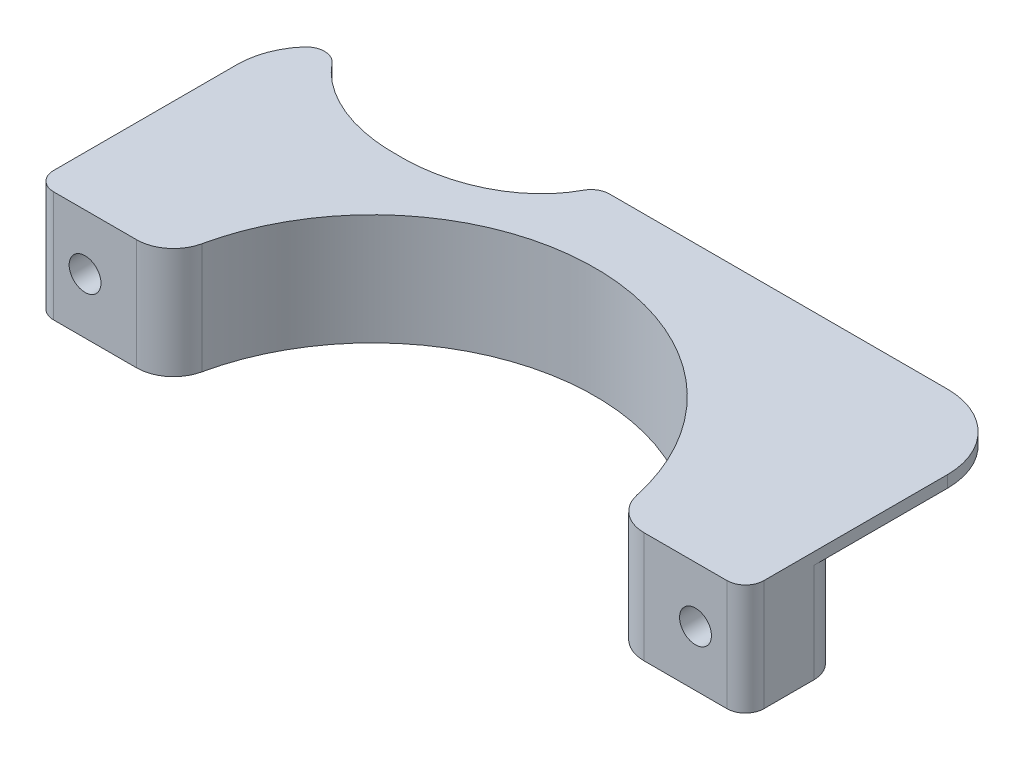
ISO-10303-21;
HEADER;
FILE_DESCRIPTION(('STEP AP214'),'2;1');
FILE_NAME('part.step','',(''),(''),'','','');
FILE_SCHEMA(('AUTOMOTIVE_DESIGN { 1 0 10303 214 1 1 1 1 }'));
ENDSEC;
DATA;
#1=APPLICATION_CONTEXT('core data for automotive mechanical design processes');
#2=APPLICATION_PROTOCOL_DEFINITION('international standard','automotive_design',2000,#1);
#3=PRODUCT_CONTEXT('',#1,'mechanical');
#4=PRODUCT('Part','Part','',(#3));
#5=PRODUCT_RELATED_PRODUCT_CATEGORY('part','',(#4));
#6=PRODUCT_DEFINITION_FORMATION('','',#4);
#7=PRODUCT_DEFINITION_CONTEXT('part definition',#1,'design');
#8=PRODUCT_DEFINITION('design','',#6,#7);
#9=PRODUCT_DEFINITION_SHAPE('','',#8);
#10=(LENGTH_UNIT() NAMED_UNIT(*) SI_UNIT(.MILLI.,.METRE.));
#11=(NAMED_UNIT(*) PLANE_ANGLE_UNIT() SI_UNIT($,.RADIAN.));
#12=(NAMED_UNIT(*) SI_UNIT($,.STERADIAN.) SOLID_ANGLE_UNIT());
#13=UNCERTAINTY_MEASURE_WITH_UNIT(LENGTH_MEASURE(1.E-05),#10,'distance_accuracy_value','');
#14=(GEOMETRIC_REPRESENTATION_CONTEXT(3) GLOBAL_UNCERTAINTY_ASSIGNED_CONTEXT((#13)) GLOBAL_UNIT_ASSIGNED_CONTEXT((#10,
#11,#12)) REPRESENTATION_CONTEXT('',''));
#15=CARTESIAN_POINT('',(0.,0.,0.));
#16=DIRECTION('',(0.,0.,1.));
#17=DIRECTION('',(1.,0.,0.));
#18=AXIS2_PLACEMENT_3D('',#15,#16,#17);
#19=CARTESIAN_POINT('',(1612.138,154.051600930678,124.642988708345));
#20=DIRECTION('',(0.,0.,1.));
#21=DIRECTION('',(-1.,0.,0.));
#22=AXIS2_PLACEMENT_3D('',#19,#20,#21);
#23=PLANE('',#22);
#24=DIRECTION('',(-1.,0.,0.));
#25=VECTOR('',#24,1.);
#26=CARTESIAN_POINT('',(1612.138,163.576600930678,124.642988708345));
#27=LINE('',#26,#25);
#28=CARTESIAN_POINT('',(1605.788,163.576600930678,124.642988708345));
#29=VERTEX_POINT('',#28);
#30=CARTESIAN_POINT('',(1576.78248811507,163.576600930678,124.642988708345));
#31=VERTEX_POINT('',#30);
#32=EDGE_CURVE('E289',#29,#31,#27,.T.);
#33=ORIENTED_EDGE('',*,*,#32,.F.);
#34=DIRECTION('',(0.,1.,0.));
#35=VECTOR('',#34,1.);
#36=CARTESIAN_POINT('',(1605.788,163.576600930678,124.642988708345));
#37=LINE('',#36,#35);
#38=CARTESIAN_POINT('',(1605.788,162.560600930678,124.642988708345));
#39=VERTEX_POINT('',#38);
#40=EDGE_CURVE('E344',#39,#29,#37,.T.);
#41=ORIENTED_EDGE('',*,*,#40,.F.);
#42=DIRECTION('',(-1.,0.,0.));
#43=VECTOR('',#42,1.);
#44=CARTESIAN_POINT('',(1581.658,162.560600930678,124.642988708345));
#45=LINE('',#44,#43);
#46=CARTESIAN_POINT('',(1576.78248811507,162.560600930678,124.642988708345));
#47=VERTEX_POINT('',#46);
#48=EDGE_CURVE('E245',#39,#47,#45,.T.);
#49=ORIENTED_EDGE('',*,*,#48,.T.);
#50=DIRECTION('',(0.,-1.,0.));
#51=VECTOR('',#50,1.);
#52=CARTESIAN_POINT('',(1576.78248811507,154.051600930678,124.642988708345));
#53=LINE('',#52,#51);
#54=EDGE_CURVE('E212',#31,#47,#53,.T.);
#55=ORIENTED_EDGE('',*,*,#54,.F.);
#56=EDGE_LOOP('',(#33,#41,#49,#55));
#57=FACE_BOUND('',#56,.T.);
#58=ADVANCED_FACE('F37',(#57),#23,.F.);
#59=CARTESIAN_POINT('',(1557.528,154.051600930678,130.992988708345));
#60=DIRECTION('',(0.,-1.,0.));
#61=DIRECTION('',(0.,0.,1.));
#62=AXIS2_PLACEMENT_3D('',#59,#60,#61);
#63=CYLINDRICAL_SURFACE('',#62,6.35);
#64=CARTESIAN_POINT('',(1557.528,162.560600930678,130.992988708345));
#65=DIRECTION('',(0.,-1.,0.));
#66=DIRECTION('',(0.,0.,-1.));
#67=AXIS2_PLACEMENT_3D('',#64,#65,#66);
#68=CIRCLE('',#67,6.35);
#69=CARTESIAN_POINT('',(1552.74874703953,162.560600930678,126.81193128948));
#70=VERTEX_POINT('',#69);
#71=CARTESIAN_POINT('',(1551.178,162.560600930678,130.992988708345));
#72=VERTEX_POINT('',#71);
#73=EDGE_CURVE('E355',#70,#72,#68,.F.);
#74=ORIENTED_EDGE('',*,*,#73,.T.);
#75=DIRECTION('',(0.,1.,0.));
#76=VECTOR('',#75,1.);
#77=CARTESIAN_POINT('',(1551.178,163.576600930678,130.992988708345));
#78=LINE('',#77,#76);
#79=CARTESIAN_POINT('',(1551.178,163.576600930678,130.992988708345));
#80=VERTEX_POINT('',#79);
#81=EDGE_CURVE('E360',#72,#80,#78,.T.);
#82=ORIENTED_EDGE('',*,*,#81,.T.);
#83=CARTESIAN_POINT('',(1557.528,163.576600930678,130.992988708345));
#84=DIRECTION('',(0.,-1.,0.));
#85=DIRECTION('',(0.,0.,-1.));
#86=AXIS2_PLACEMENT_3D('',#83,#84,#85);
#87=CIRCLE('',#86,6.35);
#88=CARTESIAN_POINT('',(1552.74874703953,163.576600930678,126.81193128948));
#89=VERTEX_POINT('',#88);
#90=EDGE_CURVE('E347',#80,#89,#87,.T.);
#91=ORIENTED_EDGE('',*,*,#90,.T.);
#92=DIRECTION('',(0.,-1.,0.));
#93=VECTOR('',#92,1.);
#94=CARTESIAN_POINT('',(1552.74874703953,154.051600930678,126.81193128948));
#95=LINE('',#94,#93);
#96=EDGE_CURVE('E12',#70,#89,#95,.F.);
#97=ORIENTED_EDGE('',*,*,#96,.F.);
#98=EDGE_LOOP('',(#74,#82,#91,#97));
#99=FACE_BOUND('',#98,.T.);
#100=ADVANCED_FACE('F505',(#99),#63,.T.);
#101=CARTESIAN_POINT('',(1551.178,154.051600930678,148.336));
#102=DIRECTION('',(0.,0.,1.));
#103=DIRECTION('',(-1.,0.,0.));
#104=AXIS2_PLACEMENT_3D('',#101,#102,#103);
#105=PLANE('',#104);
#106=CARTESIAN_POINT('',(1555.46425,158.814100930678,148.336));
#107=DIRECTION('',(0.,0.,-1.));
#108=DIRECTION('',(1.,0.,0.));
#109=AXIS2_PLACEMENT_3D('',#106,#107,#108);
#110=CIRCLE('',#109,1.36525000000017);
#111=CARTESIAN_POINT('',(1556.8295,158.814100930678,148.336));
#112=VERTEX_POINT('',#111);
#113=EDGE_CURVE('E223',#112,#112,#110,.T.);
#114=ORIENTED_EDGE('',*,*,#113,.T.);
#115=EDGE_LOOP('',(#114));
#116=FACE_BOUND('',#115,.T.);
#117=DIRECTION('',(-1.,0.,0.));
#118=VECTOR('',#117,1.);
#119=CARTESIAN_POINT('',(1551.178,163.576600930678,148.336));
#120=LINE('',#119,#118);
#121=CARTESIAN_POINT('',(1559.88345833686,163.576600930678,148.336));
#122=VERTEX_POINT('',#121);
#123=CARTESIAN_POINT('',(1552.7655,163.576600930678,148.336));
#124=VERTEX_POINT('',#123);
#125=EDGE_CURVE('E264',#122,#124,#120,.T.);
#126=ORIENTED_EDGE('',*,*,#125,.T.);
#127=DIRECTION('',(0.,1.,0.));
#128=VECTOR('',#127,1.);
#129=CARTESIAN_POINT('',(1552.7655,154.051600930678,148.336));
#130=LINE('',#129,#128);
#131=CARTESIAN_POINT('',(1552.7655,154.051600930678,148.336));
#132=VERTEX_POINT('',#131);
#133=EDGE_CURVE('E304',#132,#124,#130,.T.);
#134=ORIENTED_EDGE('',*,*,#133,.F.);
#135=DIRECTION('',(-1.,0.,0.));
#136=VECTOR('',#135,1.);
#137=CARTESIAN_POINT('',(1551.178,154.051600930678,148.336));
#138=LINE('',#137,#136);
#139=CARTESIAN_POINT('',(1559.88345833686,154.051600930678,148.336));
#140=VERTEX_POINT('',#139);
#141=EDGE_CURVE('E273',#140,#132,#138,.T.);
#142=ORIENTED_EDGE('',*,*,#141,.F.);
#143=DIRECTION('',(0.,1.,0.));
#144=VECTOR('',#143,1.);
#145=CARTESIAN_POINT('',(1559.88345833686,154.051600930678,148.336));
#146=LINE('',#145,#144);
#147=EDGE_CURVE('E334',#122,#140,#146,.F.);
#148=ORIENTED_EDGE('',*,*,#147,.F.);
#149=EDGE_LOOP('',(#126,#134,#142,#148));
#150=FACE_BOUND('',#149,.T.);
#151=ADVANCED_FACE('F513',(#116,#150),#105,.T.);
#152=CARTESIAN_POINT('',(1581.658,154.051600930678,149.86));
#153=DIRECTION('',(0.,1.,0.));
#154=DIRECTION('',(0.,0.,-1.));
#155=AXIS2_PLACEMENT_3D('',#152,#153,#154);
#156=CYLINDRICAL_SURFACE('',#155,19.1008000000002);
#157=CARTESIAN_POINT('',(1581.658,154.051600930678,149.86));
#158=DIRECTION('',(0.,1.,0.));
#159=DIRECTION('',(0.,0.,-1.));
#160=AXIS2_PLACEMENT_3D('',#157,#158,#159);
#161=CIRCLE('',#160,19.1008000000002);
#162=CARTESIAN_POINT('',(1600.32898669405,154.051600930678,145.830754846066));
#163=VERTEX_POINT('',#162);
#164=CARTESIAN_POINT('',(1562.98701330595,154.051600930678,145.830754846066));
#165=VERTEX_POINT('',#164);
#166=EDGE_CURVE('E286',#163,#165,#161,.T.);
#167=ORIENTED_EDGE('',*,*,#166,.F.);
#168=DIRECTION('',(0.,1.,0.));
#169=VECTOR('',#168,1.);
#170=CARTESIAN_POINT('',(1600.32898669405,154.051600930678,145.830754846066));
#171=LINE('',#170,#169);
#172=CARTESIAN_POINT('',(1600.32898669405,163.576600930678,145.830754846066));
#173=VERTEX_POINT('',#172);
#174=EDGE_CURVE('E324',#173,#163,#171,.F.);
#175=ORIENTED_EDGE('',*,*,#174,.F.);
#176=CARTESIAN_POINT('',(1581.658,163.576600930678,149.86));
#177=DIRECTION('',(0.,1.,0.));
#178=DIRECTION('',(0.,0.,-1.));
#179=AXIS2_PLACEMENT_3D('',#176,#177,#178);
#180=CIRCLE('',#179,19.1008000000002);
#181=CARTESIAN_POINT('',(1562.98701330595,163.576600930678,145.830754846066));
#182=VERTEX_POINT('',#181);
#183=EDGE_CURVE('E277',#173,#182,#180,.T.);
#184=ORIENTED_EDGE('',*,*,#183,.T.);
#185=DIRECTION('',(0.,1.,0.));
#186=VECTOR('',#185,1.);
#187=CARTESIAN_POINT('',(1562.98701330595,154.051600930678,145.830754846066));
#188=LINE('',#187,#186);
#189=EDGE_CURVE('E327',#165,#182,#188,.T.);
#190=ORIENTED_EDGE('',*,*,#189,.F.);
#191=EDGE_LOOP('',(#167,#175,#184,#190));
#192=FACE_BOUND('',#191,.T.);
#193=ADVANCED_FACE('F522',(#192),#156,.F.);
#194=CARTESIAN_POINT('',(1600.69790505859,154.051600930678,148.336));
#195=DIRECTION('',(0.,0.,1.));
#196=DIRECTION('',(-1.,0.,0.));
#197=AXIS2_PLACEMENT_3D('',#194,#195,#196);
#198=PLANE('',#197);
#199=CARTESIAN_POINT('',(1607.85175,158.814100930678,148.336));
#200=DIRECTION('',(0.,0.,-1.));
#201=DIRECTION('',(-1.,0.,0.));
#202=AXIS2_PLACEMENT_3D('',#199,#200,#201);
#203=CIRCLE('',#202,1.36525000000017);
#204=CARTESIAN_POINT('',(1606.4865,158.814100930678,148.336));
#205=VERTEX_POINT('',#204);
#206=EDGE_CURVE('E241',#205,#205,#203,.T.);
#207=ORIENTED_EDGE('',*,*,#206,.T.);
#208=EDGE_LOOP('',(#207));
#209=FACE_BOUND('',#208,.T.);
#210=DIRECTION('',(-1.,0.,0.));
#211=VECTOR('',#210,1.);
#212=CARTESIAN_POINT('',(1600.69790505859,154.051600930678,148.336));
#213=LINE('',#212,#211);
#214=CARTESIAN_POINT('',(1610.5505,154.051600930678,148.336));
#215=VERTEX_POINT('',#214);
#216=CARTESIAN_POINT('',(1603.43254166314,154.051600930678,148.336));
#217=VERTEX_POINT('',#216);
#218=EDGE_CURVE('E283',#215,#217,#213,.T.);
#219=ORIENTED_EDGE('',*,*,#218,.F.);
#220=DIRECTION('',(0.,1.,0.));
#221=VECTOR('',#220,1.);
#222=CARTESIAN_POINT('',(1610.5505,154.051600930678,148.336));
#223=LINE('',#222,#221);
#224=CARTESIAN_POINT('',(1610.5505,163.576600930678,148.336));
#225=VERTEX_POINT('',#224);
#226=EDGE_CURVE('E321',#225,#215,#223,.F.);
#227=ORIENTED_EDGE('',*,*,#226,.F.);
#228=DIRECTION('',(-1.,0.,0.));
#229=VECTOR('',#228,1.);
#230=CARTESIAN_POINT('',(1600.69790505859,163.576600930678,148.336));
#231=LINE('',#230,#229);
#232=CARTESIAN_POINT('',(1603.43254166314,163.576600930678,148.336));
#233=VERTEX_POINT('',#232);
#234=EDGE_CURVE('E297',#225,#233,#231,.T.);
#235=ORIENTED_EDGE('',*,*,#234,.T.);
#236=DIRECTION('',(0.,1.,0.));
#237=VECTOR('',#236,1.);
#238=CARTESIAN_POINT('',(1603.43254166314,154.051600930678,148.336));
#239=LINE('',#238,#237);
#240=EDGE_CURVE('E341',#217,#233,#239,.T.);
#241=ORIENTED_EDGE('',*,*,#240,.F.);
#242=EDGE_LOOP('',(#219,#227,#235,#241));
#243=FACE_BOUND('',#242,.T.);
#244=ADVANCED_FACE('F529',(#209,#243),#198,.T.);
#245=CARTESIAN_POINT('',(1612.138,154.051600930678,148.336));
#246=DIRECTION('',(1.,0.,0.));
#247=DIRECTION('',(0.,0.,1.));
#248=AXIS2_PLACEMENT_3D('',#245,#246,#247);
#249=PLANE('',#248);
#250=DIRECTION('',(0.,0.,-1.));
#251=VECTOR('',#250,1.);
#252=CARTESIAN_POINT('',(1612.138,162.560600930678,140.081));
#253=LINE('',#252,#251);
#254=CARTESIAN_POINT('',(1612.138,162.560600930678,142.46225));
#255=VERTEX_POINT('',#254);
#256=CARTESIAN_POINT('',(1612.138,162.560600930678,130.992988708345));
#257=VERTEX_POINT('',#256);
#258=EDGE_CURVE('E265',#255,#257,#253,.T.);
#259=ORIENTED_EDGE('',*,*,#258,.T.);
#260=DIRECTION('',(0.,1.,0.));
#261=VECTOR('',#260,1.);
#262=CARTESIAN_POINT('',(1612.138,162.560600930678,130.992988708345));
#263=LINE('',#262,#261);
#264=CARTESIAN_POINT('',(1612.138,163.576600930678,130.992988708345));
#265=VERTEX_POINT('',#264);
#266=EDGE_CURVE('E352',#265,#257,#263,.F.);
#267=ORIENTED_EDGE('',*,*,#266,.F.);
#268=DIRECTION('',(0.,0.,1.));
#269=VECTOR('',#268,1.);
#270=CARTESIAN_POINT('',(1612.138,163.576600930678,148.336));
#271=LINE('',#270,#269);
#272=CARTESIAN_POINT('',(1612.138,163.576600930678,146.7485));
#273=VERTEX_POINT('',#272);
#274=EDGE_CURVE('E294',#265,#273,#271,.T.);
#275=ORIENTED_EDGE('',*,*,#274,.T.);
#276=DIRECTION('',(0.,1.,0.));
#277=VECTOR('',#276,1.);
#278=CARTESIAN_POINT('',(1612.138,154.051600930678,146.7485));
#279=LINE('',#278,#277);
#280=CARTESIAN_POINT('',(1612.138,154.051600930678,146.7485));
#281=VERTEX_POINT('',#280);
#282=EDGE_CURVE('E318',#281,#273,#279,.T.);
#283=ORIENTED_EDGE('',*,*,#282,.F.);
#284=DIRECTION('',(0.,0.,1.));
#285=VECTOR('',#284,1.);
#286=CARTESIAN_POINT('',(1612.138,154.051600930678,148.336));
#287=LINE('',#286,#285);
#288=CARTESIAN_POINT('',(1612.138,154.051600930678,142.46225));
#289=VERTEX_POINT('',#288);
#290=EDGE_CURVE('E280',#289,#281,#287,.T.);
#291=ORIENTED_EDGE('',*,*,#290,.F.);
#292=DIRECTION('',(0.,-1.,0.));
#293=VECTOR('',#292,1.);
#294=CARTESIAN_POINT('',(1612.138,154.051600930678,142.46225));
#295=LINE('',#294,#293);
#296=EDGE_CURVE('E397',#255,#289,#295,.T.);
#297=ORIENTED_EDGE('',*,*,#296,.F.);
#298=EDGE_LOOP('',(#259,#267,#275,#283,#291,#297));
#299=FACE_BOUND('',#298,.T.);
#300=ADVANCED_FACE('F470',(#299),#249,.T.);
#301=CARTESIAN_POINT('',(1551.178,154.051600930678,148.336));
#302=DIRECTION('',(-1.,0.,0.));
#303=DIRECTION('',(0.,0.,-1.));
#304=AXIS2_PLACEMENT_3D('',#301,#302,#303);
#305=PLANE('',#304);
#306=DIRECTION('',(0.,0.,-1.));
#307=VECTOR('',#306,1.);
#308=CARTESIAN_POINT('',(1551.178,154.051600930678,148.336));
#309=LINE('',#308,#307);
#310=CARTESIAN_POINT('',(1551.178,154.051600930678,146.7485));
#311=VERTEX_POINT('',#310);
#312=CARTESIAN_POINT('',(1551.178,154.051600930678,142.46225));
#313=VERTEX_POINT('',#312);
#314=EDGE_CURVE('E276',#311,#313,#309,.T.);
#315=ORIENTED_EDGE('',*,*,#314,.F.);
#316=DIRECTION('',(0.,1.,0.));
#317=VECTOR('',#316,1.);
#318=CARTESIAN_POINT('',(1551.178,154.051600930678,146.7485));
#319=LINE('',#318,#317);
#320=CARTESIAN_POINT('',(1551.178,163.576600930678,146.7485));
#321=VERTEX_POINT('',#320);
#322=EDGE_CURVE('E311',#321,#311,#319,.F.);
#323=ORIENTED_EDGE('',*,*,#322,.F.);
#324=DIRECTION('',(0.,0.,-1.));
#325=VECTOR('',#324,1.);
#326=CARTESIAN_POINT('',(1551.178,163.576600930678,148.336));
#327=LINE('',#326,#325);
#328=EDGE_CURVE('E292',#321,#80,#327,.T.);
#329=ORIENTED_EDGE('',*,*,#328,.T.);
#330=ORIENTED_EDGE('',*,*,#81,.F.);
#331=DIRECTION('',(0.,0.,1.));
#332=VECTOR('',#331,1.);
#333=CARTESIAN_POINT('',(1551.178,162.560600930678,119.761));
#334=LINE('',#333,#332);
#335=CARTESIAN_POINT('',(1551.178,162.560600930678,142.46225));
#336=VERTEX_POINT('',#335);
#337=EDGE_CURVE('E261',#72,#336,#334,.T.);
#338=ORIENTED_EDGE('',*,*,#337,.T.);
#339=DIRECTION('',(0.,-1.,0.));
#340=VECTOR('',#339,1.);
#341=CARTESIAN_POINT('',(1551.178,162.560600930678,142.46225));
#342=LINE('',#341,#340);
#343=EDGE_CURVE('E394',#313,#336,#342,.F.);
#344=ORIENTED_EDGE('',*,*,#343,.F.);
#345=EDGE_LOOP('',(#315,#323,#329,#330,#338,#344));
#346=FACE_BOUND('',#345,.T.);
#347=ADVANCED_FACE('F501',(#346),#305,.T.);
#348=CARTESIAN_POINT('',(1581.658,154.051600930678,149.86));
#349=DIRECTION('',(0.,1.,0.));
#350=DIRECTION('',(0.,0.,-1.));
#351=AXIS2_PLACEMENT_3D('',#348,#349,#350);
#352=PLANE('',#351);
#353=DIRECTION('',(1.,0.,0.));
#354=VECTOR('',#353,1.);
#355=CARTESIAN_POINT('',(1563.55660129714,154.051600930678,140.081));
#356=LINE('',#355,#354);
#357=CARTESIAN_POINT('',(1553.55925,154.051600930678,140.081));
#358=VERTEX_POINT('',#357);
#359=CARTESIAN_POINT('',(1561.7530035167,154.051600930678,140.081));
#360=VERTEX_POINT('',#359);
#361=EDGE_CURVE('E248',#358,#360,#356,.T.);
#362=ORIENTED_EDGE('',*,*,#361,.T.);
#363=CARTESIAN_POINT('',(1561.7530035167,154.051600930678,136.906));
#364=DIRECTION('',(0.,-1.,0.));
#365=DIRECTION('',(0.,0.,-1.));
#366=AXIS2_PLACEMENT_3D('',#363,#364,#365);
#367=CIRCLE('',#366,3.175);
#368=CARTESIAN_POINT('',(1564.41409930324,154.051600930678,138.637818181818));
#369=VERTEX_POINT('',#368);
#370=EDGE_CURVE('E377',#369,#360,#367,.T.);
#371=ORIENTED_EDGE('',*,*,#370,.F.);
#372=CARTESIAN_POINT('',(1581.658,154.051600930678,149.86));
#373=DIRECTION('',(0.,-1.,0.));
#374=DIRECTION('',(0.,0.,1.));
#375=AXIS2_PLACEMENT_3D('',#372,#373,#374);
#376=CIRCLE('',#375,20.5740000000002);
#377=CARTESIAN_POINT('',(1598.90190069676,154.051600930678,138.637818181818));
#378=VERTEX_POINT('',#377);
#379=EDGE_CURVE('E253',#369,#378,#376,.T.);
#380=ORIENTED_EDGE('',*,*,#379,.T.);
#381=CARTESIAN_POINT('',(1601.5629964833,154.051600930678,136.906));
#382=DIRECTION('',(0.,-1.,0.));
#383=DIRECTION('',(0.,0.,-1.));
#384=AXIS2_PLACEMENT_3D('',#381,#382,#383);
#385=CIRCLE('',#384,3.175);
#386=CARTESIAN_POINT('',(1601.5629964833,154.051600930678,140.081));
#387=VERTEX_POINT('',#386);
#388=EDGE_CURVE('E380',#387,#378,#385,.T.);
#389=ORIENTED_EDGE('',*,*,#388,.F.);
#390=DIRECTION('',(1.,0.,0.));
#391=VECTOR('',#390,1.);
#392=CARTESIAN_POINT('',(1612.138,154.051600930678,140.081));
#393=LINE('',#392,#391);
#394=CARTESIAN_POINT('',(1609.75675,154.051600930678,140.081));
#395=VERTEX_POINT('',#394);
#396=EDGE_CURVE('E249',#387,#395,#393,.T.);
#397=ORIENTED_EDGE('',*,*,#396,.T.);
#398=CARTESIAN_POINT('',(1609.75675,154.051600930678,142.46225));
#399=DIRECTION('',(0.,-1.,0.));
#400=DIRECTION('',(0.,0.,-1.));
#401=AXIS2_PLACEMENT_3D('',#398,#399,#400);
#402=CIRCLE('',#401,2.38125);
#403=EDGE_CURVE('E389',#289,#395,#402,.F.);
#404=ORIENTED_EDGE('',*,*,#403,.F.);
#405=ORIENTED_EDGE('',*,*,#290,.T.);
#406=CARTESIAN_POINT('',(1610.5505,154.051600930678,146.7485));
#407=DIRECTION('',(0.,-1.,0.));
#408=DIRECTION('',(0.,0.,-1.));
#409=AXIS2_PLACEMENT_3D('',#406,#407,#408);
#410=CIRCLE('',#409,1.5875);
#411=EDGE_CURVE('E314',#215,#281,#410,.F.);
#412=ORIENTED_EDGE('',*,*,#411,.F.);
#413=ORIENTED_EDGE('',*,*,#218,.T.);
#414=CARTESIAN_POINT('',(1603.43254166314,154.051600930678,145.161));
#415=DIRECTION('',(0.,-1.,0.));
#416=DIRECTION('',(0.,0.,-1.));
#417=AXIS2_PLACEMENT_3D('',#414,#415,#416);
#418=CIRCLE('',#417,3.175);
#419=EDGE_CURVE('E337',#163,#217,#418,.F.);
#420=ORIENTED_EDGE('',*,*,#419,.F.);
#421=ORIENTED_EDGE('',*,*,#166,.T.);
#422=CARTESIAN_POINT('',(1559.88345833686,154.051600930678,145.161));
#423=DIRECTION('',(0.,-1.,0.));
#424=DIRECTION('',(0.,0.,-1.));
#425=AXIS2_PLACEMENT_3D('',#422,#423,#424);
#426=CIRCLE('',#425,3.175);
#427=EDGE_CURVE('E339',#140,#165,#426,.F.);
#428=ORIENTED_EDGE('',*,*,#427,.F.);
#429=ORIENTED_EDGE('',*,*,#141,.T.);
#430=CARTESIAN_POINT('',(1552.7655,154.051600930678,146.7485));
#431=DIRECTION('',(0.,-1.,0.));
#432=DIRECTION('',(0.,0.,-1.));
#433=AXIS2_PLACEMENT_3D('',#430,#431,#432);
#434=CIRCLE('',#433,1.5875);
#435=EDGE_CURVE('E316',#311,#132,#434,.F.);
#436=ORIENTED_EDGE('',*,*,#435,.F.);
#437=ORIENTED_EDGE('',*,*,#314,.T.);
#438=CARTESIAN_POINT('',(1553.55925,154.051600930678,142.46225));
#439=DIRECTION('',(0.,-1.,0.));
#440=DIRECTION('',(0.,0.,-1.));
#441=AXIS2_PLACEMENT_3D('',#438,#439,#440);
#442=CIRCLE('',#441,2.38125);
#443=EDGE_CURVE('E392',#358,#313,#442,.F.);
#444=ORIENTED_EDGE('',*,*,#443,.F.);
#445=EDGE_LOOP('',(#362,#371,#380,#389,#397,#404,#405,#412,#413,#420,#421,#428,#429,#436,#437,#444));
#446=FACE_BOUND('',#445,.T.);
#447=ADVANCED_FACE('F477',(#446),#352,.F.);
#448=CARTESIAN_POINT('',(1581.658,163.576600930678,149.86));
#449=DIRECTION('',(0.,1.,0.));
#450=DIRECTION('',(0.,0.,-1.));
#451=AXIS2_PLACEMENT_3D('',#448,#449,#450);
#452=PLANE('',#451);
#453=CARTESIAN_POINT('',(1565.21348870192,163.576600930678,122.115720618094));
#454=DIRECTION('',(0.,-1.,0.));
#455=DIRECTION('',(-1.,0.,0.));
#456=AXIS2_PLACEMENT_3D('',#453,#454,#455);
#457=ELLIPSE('',#456,11.0210462503366,8.73124999999996);
#458=CARTESIAN_POINT('',(1565.21348870192,163.576600930678,130.846970618094));
#459=VERTEX_POINT('',#458);
#460=CARTESIAN_POINT('',(1575.37902625167,163.576600930678,125.488564825466));
#461=VERTEX_POINT('',#460);
#462=EDGE_CURVE('E222',#459,#461,#457,.F.);
#463=ORIENTED_EDGE('',*,*,#462,.F.);
#464=CARTESIAN_POINT('',(1564.82220252649,163.576600930678,130.841466006151));
#465=VERTEX_POINT('',#464);
#466=EDGE_CURVE('E207',#465,#459,#457,.F.);
#467=ORIENTED_EDGE('',*,*,#466,.F.);
#468=CARTESIAN_POINT('',(1564.43091635106,163.576600930678,122.115720618094));
#469=DIRECTION('',(0.,1.,0.));
#470=DIRECTION('',(-1.,0.,0.));
#471=AXIS2_PLACEMENT_3D('',#468,#469,#470);
#472=ELLIPSE('',#471,11.0210462503366,8.73124999999997);
#473=CARTESIAN_POINT('',(1555.1738262858,163.576600930678,126.853900172212));
#474=VERTEX_POINT('',#473);
#475=EDGE_CURVE('E215',#474,#465,#472,.T.);
#476=ORIENTED_EDGE('',*,*,#475,.F.);
#477=CARTESIAN_POINT('',(1553.94356027965,163.576600930678,127.857195644196));
#478=DIRECTION('',(0.,-1.,0.));
#479=DIRECTION('',(0.,0.,-1.));
#480=AXIS2_PLACEMENT_3D('',#477,#478,#479);
#481=CIRCLE('',#480,1.5875);
#482=EDGE_CURVE('E52',#89,#474,#481,.T.);
#483=ORIENTED_EDGE('',*,*,#482,.F.);
#484=ORIENTED_EDGE('',*,*,#90,.F.);
#485=ORIENTED_EDGE('',*,*,#328,.F.);
#486=CARTESIAN_POINT('',(1552.7655,163.576600930678,146.7485));
#487=DIRECTION('',(0.,-1.,0.));
#488=DIRECTION('',(0.,0.,-1.));
#489=AXIS2_PLACEMENT_3D('',#486,#487,#488);
#490=CIRCLE('',#489,1.5875);
#491=EDGE_CURVE('E309',#124,#321,#490,.T.);
#492=ORIENTED_EDGE('',*,*,#491,.F.);
#493=ORIENTED_EDGE('',*,*,#125,.F.);
#494=CARTESIAN_POINT('',(1559.88345833686,163.576600930678,145.161));
#495=DIRECTION('',(0.,-1.,0.));
#496=DIRECTION('',(0.,0.,-1.));
#497=AXIS2_PLACEMENT_3D('',#494,#495,#496);
#498=CIRCLE('',#497,3.175);
#499=EDGE_CURVE('E332',#182,#122,#498,.T.);
#500=ORIENTED_EDGE('',*,*,#499,.F.);
#501=ORIENTED_EDGE('',*,*,#183,.F.);
#502=CARTESIAN_POINT('',(1603.43254166314,163.576600930678,145.161));
#503=DIRECTION('',(0.,-1.,0.));
#504=DIRECTION('',(0.,0.,-1.));
#505=AXIS2_PLACEMENT_3D('',#502,#503,#504);
#506=CIRCLE('',#505,3.175);
#507=EDGE_CURVE('E330',#233,#173,#506,.T.);
#508=ORIENTED_EDGE('',*,*,#507,.F.);
#509=ORIENTED_EDGE('',*,*,#234,.F.);
#510=CARTESIAN_POINT('',(1610.5505,163.576600930678,146.7485));
#511=DIRECTION('',(0.,-1.,0.));
#512=DIRECTION('',(0.,0.,-1.));
#513=AXIS2_PLACEMENT_3D('',#510,#511,#512);
#514=CIRCLE('',#513,1.5875);
#515=EDGE_CURVE('E307',#273,#225,#514,.T.);
#516=ORIENTED_EDGE('',*,*,#515,.F.);
#517=ORIENTED_EDGE('',*,*,#274,.F.);
#518=CARTESIAN_POINT('',(1605.788,163.576600930678,130.992988708345));
#519=DIRECTION('',(0.,-1.,0.));
#520=DIRECTION('',(0.,0.,-1.));
#521=AXIS2_PLACEMENT_3D('',#518,#519,#520);
#522=CIRCLE('',#521,6.35);
#523=EDGE_CURVE('E350',#29,#265,#522,.T.);
#524=ORIENTED_EDGE('',*,*,#523,.F.);
#525=ORIENTED_EDGE('',*,*,#32,.T.);
#526=CARTESIAN_POINT('',(1576.78248811507,163.576600930678,126.230488708345));
#527=DIRECTION('',(0.,-1.,0.));
#528=DIRECTION('',(0.,0.,-1.));
#529=AXIS2_PLACEMENT_3D('',#526,#527,#528);
#530=CIRCLE('',#529,1.5875);
#531=EDGE_CURVE('E436',#461,#31,#530,.T.);
#532=ORIENTED_EDGE('',*,*,#531,.F.);
#533=EDGE_LOOP('',(#463,#467,#476,#483,#484,#485,#492,#493,#500,#501,#508,#509,#516,#517,#524,
#525,#532));
#534=FACE_BOUND('',#533,.T.);
#535=ADVANCED_FACE('F219',(#534),#452,.T.);
#536=CARTESIAN_POINT('',(1581.658,162.560600930678,149.86));
#537=DIRECTION('',(0.,1.,0.));
#538=DIRECTION('',(0.,0.,-1.));
#539=AXIS2_PLACEMENT_3D('',#536,#537,#538);
#540=PLANE('',#539);
#541=ORIENTED_EDGE('',*,*,#48,.F.);
#542=CARTESIAN_POINT('',(1605.788,162.560600930678,130.992988708345));
#543=DIRECTION('',(0.,-1.,0.));
#544=DIRECTION('',(0.,0.,-1.));
#545=AXIS2_PLACEMENT_3D('',#542,#543,#544);
#546=CIRCLE('',#545,6.35);
#547=EDGE_CURVE('E358',#257,#39,#546,.F.);
#548=ORIENTED_EDGE('',*,*,#547,.F.);
#549=ORIENTED_EDGE('',*,*,#258,.F.);
#550=CARTESIAN_POINT('',(1609.75675,162.560600930678,142.46225));
#551=DIRECTION('',(0.,-1.,0.));
#552=DIRECTION('',(0.,0.,-1.));
#553=AXIS2_PLACEMENT_3D('',#550,#551,#552);
#554=CIRCLE('',#553,2.38125);
#555=CARTESIAN_POINT('',(1609.75675,162.560600930678,140.081));
#556=VERTEX_POINT('',#555);
#557=EDGE_CURVE('E232',#556,#255,#554,.T.);
#558=ORIENTED_EDGE('',*,*,#557,.F.);
#559=DIRECTION('',(1.,0.,0.));
#560=VECTOR('',#559,1.);
#561=CARTESIAN_POINT('',(1612.138,162.560600930678,140.081));
#562=LINE('',#561,#560);
#563=CARTESIAN_POINT('',(1601.5629964833,162.560600930678,140.081));
#564=VERTEX_POINT('',#563);
#565=EDGE_CURVE('E268',#564,#556,#562,.T.);
#566=ORIENTED_EDGE('',*,*,#565,.F.);
#567=CARTESIAN_POINT('',(1601.5629964833,162.560600930678,136.906));
#568=DIRECTION('',(0.,-1.,0.));
#569=DIRECTION('',(0.,0.,-1.));
#570=AXIS2_PLACEMENT_3D('',#567,#568,#569);
#571=CIRCLE('',#570,3.175);
#572=CARTESIAN_POINT('',(1598.90190069676,162.560600930678,138.637818181818));
#573=VERTEX_POINT('',#572);
#574=EDGE_CURVE('E369',#573,#564,#571,.F.);
#575=ORIENTED_EDGE('',*,*,#574,.F.);
#576=CARTESIAN_POINT('',(1581.658,162.560600930678,149.86));
#577=DIRECTION('',(0.,-1.,0.));
#578=DIRECTION('',(0.,0.,-1.));
#579=AXIS2_PLACEMENT_3D('',#576,#577,#578);
#580=CIRCLE('',#579,20.5740000000002);
#581=CARTESIAN_POINT('',(1564.41409930324,162.560600930678,138.637818181818));
#582=VERTEX_POINT('',#581);
#583=EDGE_CURVE('E260',#582,#573,#580,.T.);
#584=ORIENTED_EDGE('',*,*,#583,.F.);
#585=CARTESIAN_POINT('',(1561.7530035167,162.560600930678,136.906));
#586=DIRECTION('',(0.,-1.,0.));
#587=DIRECTION('',(0.,0.,-1.));
#588=AXIS2_PLACEMENT_3D('',#585,#586,#587);
#589=CIRCLE('',#588,3.175);
#590=CARTESIAN_POINT('',(1561.7530035167,162.560600930678,140.081));
#591=VERTEX_POINT('',#590);
#592=EDGE_CURVE('E372',#591,#582,#589,.F.);
#593=ORIENTED_EDGE('',*,*,#592,.F.);
#594=DIRECTION('',(1.,0.,0.));
#595=VECTOR('',#594,1.);
#596=CARTESIAN_POINT('',(1563.55660129714,162.560600930678,140.081));
#597=LINE('',#596,#595);
#598=CARTESIAN_POINT('',(1553.55925,162.560600930678,140.081));
#599=VERTEX_POINT('',#598);
#600=EDGE_CURVE('E252',#599,#591,#597,.T.);
#601=ORIENTED_EDGE('',*,*,#600,.F.);
#602=CARTESIAN_POINT('',(1553.55925,162.560600930678,142.46225));
#603=DIRECTION('',(0.,-1.,0.));
#604=DIRECTION('',(0.,0.,-1.));
#605=AXIS2_PLACEMENT_3D('',#602,#603,#604);
#606=CIRCLE('',#605,2.38125);
#607=EDGE_CURVE('E401',#336,#599,#606,.T.);
#608=ORIENTED_EDGE('',*,*,#607,.F.);
#609=ORIENTED_EDGE('',*,*,#337,.F.);
#610=ORIENTED_EDGE('',*,*,#73,.F.);
#611=CARTESIAN_POINT('',(1553.94356027965,162.560600930678,127.857195644196));
#612=DIRECTION('',(0.,-1.,0.));
#613=DIRECTION('',(0.,0.,-1.));
#614=AXIS2_PLACEMENT_3D('',#611,#612,#613);
#615=CIRCLE('',#614,1.5875);
#616=CARTESIAN_POINT('',(1555.1738262858,162.560600930678,126.853900172212));
#617=VERTEX_POINT('',#616);
#618=EDGE_CURVE('E439',#617,#70,#615,.F.);
#619=ORIENTED_EDGE('',*,*,#618,.F.);
#620=CARTESIAN_POINT('',(1564.43091635106,162.560600930678,122.115720618094));
#621=DIRECTION('',(0.,-1.,0.));
#622=DIRECTION('',(-1.,0.,0.));
#623=AXIS2_PLACEMENT_3D('',#620,#621,#622);
#624=ELLIPSE('',#623,11.0210462503366,8.73124999999996);
#625=CARTESIAN_POINT('',(1564.43091635106,162.560600930678,130.846970618094));
#626=VERTEX_POINT('',#625);
#627=EDGE_CURVE('E228',#617,#626,#624,.F.);
#628=ORIENTED_EDGE('',*,*,#627,.T.);
#629=CARTESIAN_POINT('',(1564.82220252649,162.560600930678,130.841466006151));
#630=VERTEX_POINT('',#629);
#631=EDGE_CURVE('E210',#626,#630,#624,.F.);
#632=ORIENTED_EDGE('',*,*,#631,.T.);
#633=CARTESIAN_POINT('',(1565.21348870192,162.560600930678,122.115720618094));
#634=DIRECTION('',(0.,1.,0.));
#635=DIRECTION('',(-1.,0.,0.));
#636=AXIS2_PLACEMENT_3D('',#633,#634,#635);
#637=ELLIPSE('',#636,11.0210462503366,8.73124999999997);
#638=CARTESIAN_POINT('',(1575.37902625167,162.560600930678,125.488564825466));
#639=VERTEX_POINT('',#638);
#640=EDGE_CURVE('E217',#630,#639,#637,.T.);
#641=ORIENTED_EDGE('',*,*,#640,.T.);
#642=CARTESIAN_POINT('',(1576.78248811507,162.560600930678,126.230488708345));
#643=DIRECTION('',(0.,-1.,0.));
#644=DIRECTION('',(0.,0.,-1.));
#645=AXIS2_PLACEMENT_3D('',#642,#643,#644);
#646=CIRCLE('',#645,1.5875);
#647=EDGE_CURVE('E446',#47,#639,#646,.F.);
#648=ORIENTED_EDGE('',*,*,#647,.F.);
#649=EDGE_LOOP('',(#541,#548,#549,#558,#566,#575,#584,#593,#601,#608,#609,#610,#619,#628,#632,
#641,#648));
#650=FACE_BOUND('',#649,.T.);
#651=ADVANCED_FACE('F445',(#650),#540,.F.);
#652=CARTESIAN_POINT('',(1563.55660129714,227.834082985299,140.081));
#653=DIRECTION('',(0.,0.,1.));
#654=DIRECTION('',(-1.,0.,0.));
#655=AXIS2_PLACEMENT_3D('',#652,#653,#654);
#656=PLANE('',#655);
#657=CARTESIAN_POINT('',(1555.46425,158.814100930678,140.081));
#658=DIRECTION('',(0.,0.,-1.));
#659=DIRECTION('',(-1.,0.,0.));
#660=AXIS2_PLACEMENT_3D('',#657,#658,#659);
#661=CIRCLE('',#660,1.36525000000017);
#662=CARTESIAN_POINT('',(1554.099,158.814100930678,140.081));
#663=VERTEX_POINT('',#662);
#664=EDGE_CURVE('E226',#663,#663,#661,.T.);
#665=ORIENTED_EDGE('',*,*,#664,.F.);
#666=EDGE_LOOP('',(#665));
#667=FACE_BOUND('',#666,.T.);
#668=ORIENTED_EDGE('',*,*,#600,.T.);
#669=DIRECTION('',(0.,1.,0.));
#670=VECTOR('',#669,1.);
#671=CARTESIAN_POINT('',(1561.7530035167,162.560600930678,140.081));
#672=LINE('',#671,#670);
#673=EDGE_CURVE('E367',#360,#591,#672,.T.);
#674=ORIENTED_EDGE('',*,*,#673,.F.);
#675=ORIENTED_EDGE('',*,*,#361,.F.);
#676=DIRECTION('',(0.,-1.,0.));
#677=VECTOR('',#676,1.);
#678=CARTESIAN_POINT('',(1553.55925,154.051600930678,140.081));
#679=LINE('',#678,#677);
#680=EDGE_CURVE('E383',#599,#358,#679,.T.);
#681=ORIENTED_EDGE('',*,*,#680,.F.);
#682=EDGE_LOOP('',(#668,#674,#675,#681));
#683=FACE_BOUND('',#682,.T.);
#684=ADVANCED_FACE('F493',(#667,#683),#656,.F.);
#685=CARTESIAN_POINT('',(1581.658,227.834082985299,149.86));
#686=DIRECTION('',(0.,-1.,0.));
#687=DIRECTION('',(0.,0.,1.));
#688=AXIS2_PLACEMENT_3D('',#685,#686,#687);
#689=CYLINDRICAL_SURFACE('',#688,20.5740000000002);
#690=ORIENTED_EDGE('',*,*,#583,.T.);
#691=DIRECTION('',(0.,-1.,0.));
#692=VECTOR('',#691,1.);
#693=CARTESIAN_POINT('',(1598.90190069676,227.834082985299,138.637818181818));
#694=LINE('',#693,#692);
#695=EDGE_CURVE('E363',#378,#573,#694,.F.);
#696=ORIENTED_EDGE('',*,*,#695,.F.);
#697=ORIENTED_EDGE('',*,*,#379,.F.);
#698=DIRECTION('',(0.,-1.,0.));
#699=VECTOR('',#698,1.);
#700=CARTESIAN_POINT('',(1564.41409930324,227.834082985299,138.637818181818));
#701=LINE('',#700,#699);
#702=EDGE_CURVE('E365',#582,#369,#701,.T.);
#703=ORIENTED_EDGE('',*,*,#702,.F.);
#704=EDGE_LOOP('',(#690,#696,#697,#703));
#705=FACE_BOUND('',#704,.T.);
#706=ADVANCED_FACE('F488',(#705),#689,.T.);
#707=CARTESIAN_POINT('',(1612.138,227.834082985299,140.081));
#708=DIRECTION('',(0.,0.,1.));
#709=DIRECTION('',(-1.,0.,0.));
#710=AXIS2_PLACEMENT_3D('',#707,#708,#709);
#711=PLANE('',#710);
#712=CARTESIAN_POINT('',(1607.85175,158.814100930678,140.081));
#713=DIRECTION('',(0.,0.,-1.));
#714=DIRECTION('',(-1.,0.,0.));
#715=AXIS2_PLACEMENT_3D('',#712,#713,#714);
#716=CIRCLE('',#715,1.36525000000017);
#717=CARTESIAN_POINT('',(1606.4865,158.814100930678,140.081));
#718=VERTEX_POINT('',#717);
#719=EDGE_CURVE('E244',#718,#718,#716,.T.);
#720=ORIENTED_EDGE('',*,*,#719,.F.);
#721=EDGE_LOOP('',(#720));
#722=FACE_BOUND('',#721,.T.);
#723=ORIENTED_EDGE('',*,*,#396,.F.);
#724=DIRECTION('',(0.,1.,0.));
#725=VECTOR('',#724,1.);
#726=CARTESIAN_POINT('',(1601.5629964833,154.051600930678,140.081));
#727=LINE('',#726,#725);
#728=EDGE_CURVE('E375',#564,#387,#727,.F.);
#729=ORIENTED_EDGE('',*,*,#728,.F.);
#730=ORIENTED_EDGE('',*,*,#565,.T.);
#731=DIRECTION('',(0.,-1.,0.));
#732=VECTOR('',#731,1.);
#733=CARTESIAN_POINT('',(1609.75675,162.560600930678,140.081));
#734=LINE('',#733,#732);
#735=EDGE_CURVE('E400',#395,#556,#734,.F.);
#736=ORIENTED_EDGE('',*,*,#735,.F.);
#737=EDGE_LOOP('',(#723,#729,#730,#736));
#738=FACE_BOUND('',#737,.T.);
#739=ADVANCED_FACE('F479',(#722,#738),#711,.F.);
#740=CARTESIAN_POINT('',(1552.7655,154.051600930678,146.7485));
#741=DIRECTION('',(0.,1.,0.));
#742=DIRECTION('',(0.,0.,-1.));
#743=AXIS2_PLACEMENT_3D('',#740,#741,#742);
#744=CYLINDRICAL_SURFACE('',#743,1.5875);
#745=ORIENTED_EDGE('',*,*,#435,.T.);
#746=ORIENTED_EDGE('',*,*,#133,.T.);
#747=ORIENTED_EDGE('',*,*,#491,.T.);
#748=ORIENTED_EDGE('',*,*,#322,.T.);
#749=EDGE_LOOP('',(#745,#746,#747,#748));
#750=FACE_BOUND('',#749,.T.);
#751=ADVANCED_FACE('F509',(#750),#744,.T.);
#752=CARTESIAN_POINT('',(1610.5505,154.051600930678,146.7485));
#753=DIRECTION('',(0.,1.,0.));
#754=DIRECTION('',(0.,0.,-1.));
#755=AXIS2_PLACEMENT_3D('',#752,#753,#754);
#756=CYLINDRICAL_SURFACE('',#755,1.5875);
#757=ORIENTED_EDGE('',*,*,#411,.T.);
#758=ORIENTED_EDGE('',*,*,#282,.T.);
#759=ORIENTED_EDGE('',*,*,#515,.T.);
#760=ORIENTED_EDGE('',*,*,#226,.T.);
#761=EDGE_LOOP('',(#757,#758,#759,#760));
#762=FACE_BOUND('',#761,.T.);
#763=ADVANCED_FACE('F531',(#762),#756,.T.);
#764=CARTESIAN_POINT('',(1559.88345833686,154.051600930678,145.161));
#765=DIRECTION('',(0.,1.,0.));
#766=DIRECTION('',(0.,0.,-1.));
#767=AXIS2_PLACEMENT_3D('',#764,#765,#766);
#768=CYLINDRICAL_SURFACE('',#767,3.175);
#769=ORIENTED_EDGE('',*,*,#427,.T.);
#770=ORIENTED_EDGE('',*,*,#189,.T.);
#771=ORIENTED_EDGE('',*,*,#499,.T.);
#772=ORIENTED_EDGE('',*,*,#147,.T.);
#773=EDGE_LOOP('',(#769,#770,#771,#772));
#774=FACE_BOUND('',#773,.T.);
#775=ADVANCED_FACE('F515',(#774),#768,.T.);
#776=CARTESIAN_POINT('',(1603.43254166314,154.051600930678,145.161));
#777=DIRECTION('',(0.,1.,0.));
#778=DIRECTION('',(0.,0.,-1.));
#779=AXIS2_PLACEMENT_3D('',#776,#777,#778);
#780=CYLINDRICAL_SURFACE('',#779,3.175);
#781=ORIENTED_EDGE('',*,*,#419,.T.);
#782=ORIENTED_EDGE('',*,*,#240,.T.);
#783=ORIENTED_EDGE('',*,*,#507,.T.);
#784=ORIENTED_EDGE('',*,*,#174,.T.);
#785=EDGE_LOOP('',(#781,#782,#783,#784));
#786=FACE_BOUND('',#785,.T.);
#787=ADVANCED_FACE('F524',(#786),#780,.T.);
#788=CARTESIAN_POINT('',(1605.788,154.051600930678,130.992988708345));
#789=DIRECTION('',(0.,-1.,0.));
#790=DIRECTION('',(0.,0.,1.));
#791=AXIS2_PLACEMENT_3D('',#788,#789,#790);
#792=CYLINDRICAL_SURFACE('',#791,6.35);
#793=ORIENTED_EDGE('',*,*,#547,.T.);
#794=ORIENTED_EDGE('',*,*,#40,.T.);
#795=ORIENTED_EDGE('',*,*,#523,.T.);
#796=ORIENTED_EDGE('',*,*,#266,.T.);
#797=EDGE_LOOP('',(#793,#794,#795,#796));
#798=FACE_BOUND('',#797,.T.);
#799=ADVANCED_FACE('F467',(#798),#792,.T.);
#800=CARTESIAN_POINT('',(1561.7530035167,227.834082985299,136.906));
#801=DIRECTION('',(0.,-1.,0.));
#802=DIRECTION('',(0.,0.,1.));
#803=AXIS2_PLACEMENT_3D('',#800,#801,#802);
#804=CYLINDRICAL_SURFACE('',#803,3.175);
#805=ORIENTED_EDGE('',*,*,#592,.T.);
#806=ORIENTED_EDGE('',*,*,#702,.T.);
#807=ORIENTED_EDGE('',*,*,#370,.T.);
#808=ORIENTED_EDGE('',*,*,#673,.T.);
#809=EDGE_LOOP('',(#805,#806,#807,#808));
#810=FACE_BOUND('',#809,.T.);
#811=ADVANCED_FACE('F491',(#810),#804,.F.);
#812=CARTESIAN_POINT('',(1601.5629964833,227.834082985299,136.906));
#813=DIRECTION('',(0.,-1.,0.));
#814=DIRECTION('',(0.,0.,1.));
#815=AXIS2_PLACEMENT_3D('',#812,#813,#814);
#816=CYLINDRICAL_SURFACE('',#815,3.175);
#817=ORIENTED_EDGE('',*,*,#574,.T.);
#818=ORIENTED_EDGE('',*,*,#728,.T.);
#819=ORIENTED_EDGE('',*,*,#388,.T.);
#820=ORIENTED_EDGE('',*,*,#695,.T.);
#821=EDGE_LOOP('',(#817,#818,#819,#820));
#822=FACE_BOUND('',#821,.T.);
#823=ADVANCED_FACE('F485',(#822),#816,.F.);
#824=CARTESIAN_POINT('',(1607.85175,158.814100930678,124.642988708345));
#825=DIRECTION('',(0.,0.,1.));
#826=DIRECTION('',(-1.,0.,0.));
#827=AXIS2_PLACEMENT_3D('',#824,#825,#826);
#828=CYLINDRICAL_SURFACE('',#827,1.36525000000017);
#829=ORIENTED_EDGE('',*,*,#206,.F.);
#830=EDGE_LOOP('',(#829));
#831=FACE_BOUND('',#830,.T.);
#832=ORIENTED_EDGE('',*,*,#719,.T.);
#833=EDGE_LOOP('',(#832));
#834=FACE_BOUND('',#833,.T.);
#835=ADVANCED_FACE('F548',(#831,#834),#828,.F.);
#836=CARTESIAN_POINT('',(1555.46425,158.814100930678,124.642988708345));
#837=DIRECTION('',(0.,0.,1.));
#838=DIRECTION('',(-1.,0.,0.));
#839=AXIS2_PLACEMENT_3D('',#836,#837,#838);
#840=CYLINDRICAL_SURFACE('',#839,1.36525000000017);
#841=ORIENTED_EDGE('',*,*,#113,.F.);
#842=EDGE_LOOP('',(#841));
#843=FACE_BOUND('',#842,.T.);
#844=ORIENTED_EDGE('',*,*,#664,.T.);
#845=EDGE_LOOP('',(#844));
#846=FACE_BOUND('',#845,.T.);
#847=ADVANCED_FACE('F578',(#843,#846),#840,.F.);
#848=CARTESIAN_POINT('',(1553.55925,227.834082985299,142.46225));
#849=DIRECTION('',(0.,1.,0.));
#850=DIRECTION('',(0.,0.,-1.));
#851=AXIS2_PLACEMENT_3D('',#848,#849,#850);
#852=CYLINDRICAL_SURFACE('',#851,2.38125);
#853=ORIENTED_EDGE('',*,*,#607,.T.);
#854=ORIENTED_EDGE('',*,*,#680,.T.);
#855=ORIENTED_EDGE('',*,*,#443,.T.);
#856=ORIENTED_EDGE('',*,*,#343,.T.);
#857=EDGE_LOOP('',(#853,#854,#855,#856));
#858=FACE_BOUND('',#857,.T.);
#859=ADVANCED_FACE('F496',(#858),#852,.T.);
#860=CARTESIAN_POINT('',(1609.75675,154.051600930678,142.46225));
#861=DIRECTION('',(0.,1.,0.));
#862=DIRECTION('',(0.,0.,-1.));
#863=AXIS2_PLACEMENT_3D('',#860,#861,#862);
#864=CYLINDRICAL_SURFACE('',#863,2.38125);
#865=ORIENTED_EDGE('',*,*,#557,.T.);
#866=ORIENTED_EDGE('',*,*,#296,.T.);
#867=ORIENTED_EDGE('',*,*,#403,.T.);
#868=ORIENTED_EDGE('',*,*,#735,.T.);
#869=EDGE_LOOP('',(#865,#866,#867,#868));
#870=FACE_BOUND('',#869,.T.);
#871=ADVANCED_FACE('F473',(#870),#864,.T.);
#872=CARTESIAN_POINT('',(1582.68653143016,186.261546791979,122.115720618094));
#873=DIRECTION('',(-0.61021712344484,-0.792234221840174,0.));
#874=DIRECTION('',(0.792234221840174,-0.61021712344484,0.));
#875=AXIS2_PLACEMENT_3D('',#872,#873,#874);
#876=CYLINDRICAL_SURFACE('',#875,8.73124999999996);
#877=CARTESIAN_POINT('',(1564.82220252649,163.576600930677,130.841466006151));
#878=CARTESIAN_POINT('',(1564.69566175598,163.248029591037,130.845026419994));
#879=CARTESIAN_POINT('',(1564.56911932278,162.919453934144,130.846859662122));
#880=CARTESIAN_POINT('',(1564.43868893653,162.580782954295,130.846968990059));
#881=CARTESIAN_POINT('',(1564.43480264458,162.570691944523,130.846970618579));
#882=CARTESIAN_POINT('',(1564.43091635106,162.560600930678,130.846970618094));
#883=B_SPLINE_CURVE_WITH_KNOTS('',3,(#877,#878,#879,#880,#881,#882),.UNSPECIFIED.,.F.,.F.,(4,2,
4),(0.,1.05631661650633,1.08875711147759),.UNSPECIFIED.);
#884=EDGE_CURVE('E204',#626,#465,#883,.F.);
#885=ORIENTED_EDGE('',*,*,#884,.T.);
#886=ORIENTED_EDGE('',*,*,#466,.T.);
#887=CARTESIAN_POINT('',(1564.82220252649,162.560600930678,130.841466006151));
#888=CARTESIAN_POINT('',(1564.94874329701,162.889172270315,130.845026419994));
#889=CARTESIAN_POINT('',(1565.0752857302,163.217747927209,130.846859662122));
#890=CARTESIAN_POINT('',(1565.20571611646,163.55641890706,130.846968990059));
#891=CARTESIAN_POINT('',(1565.20960240841,163.566509916833,130.846970618579));
#892=CARTESIAN_POINT('',(1565.21348870192,163.576600930678,130.846970618094));
#893=B_SPLINE_CURVE_WITH_KNOTS('',3,(#887,#888,#889,#890,#891,#892),.UNSPECIFIED.,.F.,.F.,(4,2,
4),(0.,1.05631661650784,1.08875711147907),.UNSPECIFIED.);
#894=EDGE_CURVE('E213',#459,#630,#893,.F.);
#895=ORIENTED_EDGE('',*,*,#894,.T.);
#896=ORIENTED_EDGE('',*,*,#631,.F.);
#897=EDGE_LOOP('',(#885,#886,#895,#896));
#898=FACE_BOUND('',#897,.T.);
#899=ADVANCED_FACE('F205',(#898),#876,.F.);
#900=DIRECTION('',(0.,-1.,0.));
#901=VECTOR('',#900,1.);
#902=SURFACE_OF_LINEAR_EXTRUSION('',#472,#901);
#903=ORIENTED_EDGE('',*,*,#475,.T.);
#904=ORIENTED_EDGE('',*,*,#884,.F.);
#905=ORIENTED_EDGE('',*,*,#627,.F.);
#906=DIRECTION('',(0.,-1.,0.));
#907=VECTOR('',#906,1.);
#908=CARTESIAN_POINT('',(1555.1738262858,163.576600930678,126.853900172212));
#909=LINE('',#908,#907);
#910=EDGE_CURVE('E45',#474,#617,#909,.T.);
#911=ORIENTED_EDGE('',*,*,#910,.F.);
#912=EDGE_LOOP('',(#903,#904,#905,#911));
#913=FACE_BOUND('',#912,.T.);
#914=ADVANCED_FACE('F216',(#913),#902,.T.);
#915=CARTESIAN_POINT('',(1565.21348870192,163.576600930678,122.115720618094));
#916=DIRECTION('',(0.,1.,0.));
#917=DIRECTION('',(-1.,0.,0.));
#918=AXIS2_PLACEMENT_3D('',#915,#916,#917);
#919=ELLIPSE('',#918,11.0210462503366,8.73124999999997);
#920=DIRECTION('',(0.,-1.,0.));
#921=VECTOR('',#920,1.);
#922=SURFACE_OF_LINEAR_EXTRUSION('',#919,#921);
#923=ORIENTED_EDGE('',*,*,#640,.F.);
#924=ORIENTED_EDGE('',*,*,#894,.F.);
#925=ORIENTED_EDGE('',*,*,#462,.T.);
#926=DIRECTION('',(0.,-1.,0.));
#927=VECTOR('',#926,1.);
#928=CARTESIAN_POINT('',(1575.37902625167,162.560600930678,125.488564825466));
#929=LINE('',#928,#927);
#930=EDGE_CURVE('E433',#639,#461,#929,.F.);
#931=ORIENTED_EDGE('',*,*,#930,.F.);
#932=EDGE_LOOP('',(#923,#924,#925,#931));
#933=FACE_BOUND('',#932,.T.);
#934=ADVANCED_FACE('F421',(#933),#922,.T.);
#935=CARTESIAN_POINT('',(1576.78248811507,163.068600930678,126.230488708345));
#936=DIRECTION('',(0.,-1.,0.));
#937=DIRECTION('',(0.,0.,1.));
#938=AXIS2_PLACEMENT_3D('',#935,#936,#937);
#939=CYLINDRICAL_SURFACE('',#938,1.5875);
#940=ORIENTED_EDGE('',*,*,#531,.T.);
#941=ORIENTED_EDGE('',*,*,#54,.T.);
#942=ORIENTED_EDGE('',*,*,#647,.T.);
#943=ORIENTED_EDGE('',*,*,#930,.T.);
#944=EDGE_LOOP('',(#940,#941,#942,#943));
#945=FACE_BOUND('',#944,.T.);
#946=ADVANCED_FACE('F424',(#945),#939,.T.);
#947=CARTESIAN_POINT('',(1553.94356027965,163.068600930678,127.857195644196));
#948=DIRECTION('',(0.,-1.,0.));
#949=DIRECTION('',(0.,0.,1.));
#950=AXIS2_PLACEMENT_3D('',#947,#948,#949);
#951=CYLINDRICAL_SURFACE('',#950,1.5875);
#952=ORIENTED_EDGE('',*,*,#482,.T.);
#953=ORIENTED_EDGE('',*,*,#910,.T.);
#954=ORIENTED_EDGE('',*,*,#618,.T.);
#955=ORIENTED_EDGE('',*,*,#96,.T.);
#956=EDGE_LOOP('',(#952,#953,#954,#955));
#957=FACE_BOUND('',#956,.T.);
#958=ADVANCED_FACE('F39',(#957),#951,.T.);
#959=CLOSED_SHELL('',(#58,#100,#151,#193,#244,#300,#347,#447,#535,#651,#684,#706,#739,#751,#763,
#775,#787,#799,#811,#823,#835,#847,#859,#871,#899,#914,#934,#946,#958));
#960=MANIFOLD_SOLID_BREP('B2',#959);
#961=ADVANCED_BREP_SHAPE_REPRESENTATION('',(#18,#960),#14);
#962=SHAPE_DEFINITION_REPRESENTATION(#9,#961);
ENDSEC;
END-ISO-10303-21;
